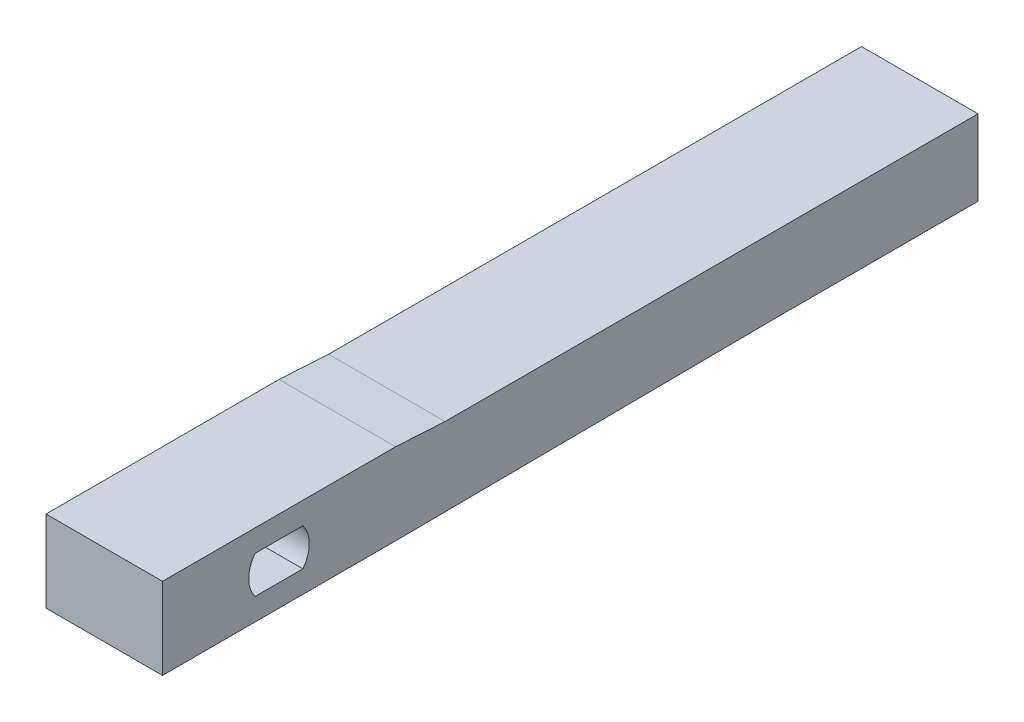
ISO-10303-21;
HEADER;
FILE_DESCRIPTION(('STEP AP214'),'2;1');
FILE_NAME('part.step','',(''),(''),'','','');
FILE_SCHEMA(('AUTOMOTIVE_DESIGN { 1 0 10303 214 1 1 1 1 }'));
ENDSEC;
DATA;
#1=APPLICATION_CONTEXT('core data for automotive mechanical design processes');
#2=APPLICATION_PROTOCOL_DEFINITION('international standard','automotive_design',2000,#1);
#3=PRODUCT_CONTEXT('',#1,'mechanical');
#4=PRODUCT('Part','Part','',(#3));
#5=PRODUCT_RELATED_PRODUCT_CATEGORY('part','',(#4));
#6=PRODUCT_DEFINITION_FORMATION('','',#4);
#7=PRODUCT_DEFINITION_CONTEXT('part definition',#1,'design');
#8=PRODUCT_DEFINITION('design','',#6,#7);
#9=PRODUCT_DEFINITION_SHAPE('','',#8);
#10=(LENGTH_UNIT() NAMED_UNIT(*) SI_UNIT(.MILLI.,.METRE.));
#11=(NAMED_UNIT(*) PLANE_ANGLE_UNIT() SI_UNIT($,.RADIAN.));
#12=(NAMED_UNIT(*) SI_UNIT($,.STERADIAN.) SOLID_ANGLE_UNIT());
#13=UNCERTAINTY_MEASURE_WITH_UNIT(LENGTH_MEASURE(1.E-05),#10,'distance_accuracy_value','');
#14=(GEOMETRIC_REPRESENTATION_CONTEXT(3) GLOBAL_UNCERTAINTY_ASSIGNED_CONTEXT((#13)) GLOBAL_UNIT_ASSIGNED_CONTEXT((#10,
#11,#12)) REPRESENTATION_CONTEXT('',''));
#15=CARTESIAN_POINT('',(0.,0.,0.));
#16=DIRECTION('',(0.,0.,1.));
#17=DIRECTION('',(1.,0.,0.));
#18=AXIS2_PLACEMENT_3D('',#15,#16,#17);
#19=CARTESIAN_POINT('',(-14.,0.,0.));
#20=DIRECTION('',(1.,0.,0.));
#21=DIRECTION('',(0.,0.,-1.));
#22=AXIS2_PLACEMENT_3D('',#19,#20,#21);
#23=PLANE('',#22);
#24=DIRECTION('',(0.,-0.0585719765468977,-0.998283188060076));
#25=VECTOR('',#24,1.);
#26=CARTESIAN_POINT('',(-14.,11.25,-14.2609249632406));
#27=LINE('',#26,#25);
#28=CARTESIAN_POINT('',(-14.,11.5,-10.));
#29=VERTEX_POINT('',#28);
#30=CARTESIAN_POINT('',(-14.,11.25,-14.2609249632406));
#31=VERTEX_POINT('',#30);
#32=EDGE_CURVE('E164',#29,#31,#27,.T.);
#33=ORIENTED_EDGE('',*,*,#32,.T.);
#34=DIRECTION('',(0.,0.,-1.));
#35=VECTOR('',#34,1.);
#36=CARTESIAN_POINT('',(-14.,11.25,-60.));
#37=LINE('',#36,#35);
#38=CARTESIAN_POINT('',(-14.,11.25,-60.));
#39=VERTEX_POINT('',#38);
#40=EDGE_CURVE('E167',#31,#39,#37,.T.);
#41=ORIENTED_EDGE('',*,*,#40,.T.);
#42=DIRECTION('',(0.,-1.,0.));
#43=VECTOR('',#42,1.);
#44=CARTESIAN_POINT('',(-14.,11.25,-60.));
#45=LINE('',#44,#43);
#46=CARTESIAN_POINT('',(-14.,4.74999999999999,-60.));
#47=VERTEX_POINT('',#46);
#48=EDGE_CURVE('E170',#39,#47,#45,.T.);
#49=ORIENTED_EDGE('',*,*,#48,.T.);
#50=DIRECTION('',(0.,0.,1.));
#51=VECTOR('',#50,1.);
#52=CARTESIAN_POINT('',(-14.,4.74999999999999,-60.));
#53=LINE('',#52,#51);
#54=CARTESIAN_POINT('',(-14.,4.74999999999999,-42.6358669668135));
#55=VERTEX_POINT('',#54);
#56=EDGE_CURVE('E172',#47,#55,#53,.T.);
#57=ORIENTED_EDGE('',*,*,#56,.T.);
#58=DIRECTION('',(0.,-0.00766005896468735,0.99997066131795));
#59=VECTOR('',#58,1.);
#60=CARTESIAN_POINT('',(-14.,4.74999999999999,-42.6358669668135));
#61=LINE('',#60,#59);
#62=CARTESIAN_POINT('',(-14.,4.5,-10.));
#63=VERTEX_POINT('',#62);
#64=EDGE_CURVE('E174',#55,#63,#61,.T.);
#65=ORIENTED_EDGE('',*,*,#64,.T.);
#66=DIRECTION('',(0.,0.,1.));
#67=VECTOR('',#66,1.);
#68=CARTESIAN_POINT('',(-14.,4.5,-10.));
#69=LINE('',#68,#67);
#70=CARTESIAN_POINT('',(-14.,4.5,9.99999999999999));
#71=VERTEX_POINT('',#70);
#72=EDGE_CURVE('E176',#63,#71,#69,.T.);
#73=ORIENTED_EDGE('',*,*,#72,.T.);
#74=DIRECTION('',(0.,1.,0.));
#75=VECTOR('',#74,1.);
#76=CARTESIAN_POINT('',(-14.,11.5,9.99999999999999));
#77=LINE('',#76,#75);
#78=CARTESIAN_POINT('',(-14.,11.5,9.99999999999999));
#79=VERTEX_POINT('',#78);
#80=EDGE_CURVE('E178',#71,#79,#77,.T.);
#81=ORIENTED_EDGE('',*,*,#80,.T.);
#82=DIRECTION('',(0.,0.,-1.));
#83=VECTOR('',#82,1.);
#84=CARTESIAN_POINT('',(-14.,11.5,-10.));
#85=LINE('',#84,#83);
#86=EDGE_CURVE('E180',#79,#29,#85,.T.);
#87=ORIENTED_EDGE('',*,*,#86,.T.);
#88=EDGE_LOOP('',(#33,#41,#49,#57,#65,#73,#81,#87));
#89=FACE_BOUND('',#88,.T.);
#90=CARTESIAN_POINT('',(-14.,8.,0.));
#91=DIRECTION('',(-1.,0.,0.));
#92=DIRECTION('',(0.,0.,1.));
#93=AXIS2_PLACEMENT_3D('',#90,#91,#92);
#94=CIRCLE('',#93,2.6);
#95=CARTESIAN_POINT('',(-14.,9.6,-2.04939015319192));
#96=VERTEX_POINT('',#95);
#97=CARTESIAN_POINT('',(-14.,6.4,-2.04939015319192));
#98=VERTEX_POINT('',#97);
#99=EDGE_CURVE('E128',#96,#98,#94,.T.);
#100=ORIENTED_EDGE('',*,*,#99,.F.);
#101=DIRECTION('',(0.,0.,-1.));
#102=VECTOR('',#101,1.);
#103=CARTESIAN_POINT('',(-14.,9.6,-2.04939015319192));
#104=LINE('',#103,#102);
#105=CARTESIAN_POINT('',(-14.,9.6,2.04939015319192));
#106=VERTEX_POINT('',#105);
#107=EDGE_CURVE('E150',#106,#96,#104,.T.);
#108=ORIENTED_EDGE('',*,*,#107,.F.);
#109=CARTESIAN_POINT('',(-14.,8.,0.));
#110=DIRECTION('',(-1.,0.,0.));
#111=DIRECTION('',(0.,0.,1.));
#112=AXIS2_PLACEMENT_3D('',#109,#110,#111);
#113=CIRCLE('',#112,2.6);
#114=CARTESIAN_POINT('',(-14.,6.4,2.04939015319192));
#115=VERTEX_POINT('',#114);
#116=EDGE_CURVE('E148',#115,#106,#113,.T.);
#117=ORIENTED_EDGE('',*,*,#116,.F.);
#118=DIRECTION('',(0.,0.,1.));
#119=VECTOR('',#118,1.);
#120=CARTESIAN_POINT('',(-14.,6.4,2.04939015319192));
#121=LINE('',#120,#119);
#122=EDGE_CURVE('E136',#98,#115,#121,.T.);
#123=ORIENTED_EDGE('',*,*,#122,.F.);
#124=EDGE_LOOP('',(#100,#108,#117,#123));
#125=FACE_BOUND('',#124,.T.);
#126=ADVANCED_FACE('F39',(#89,#125),#23,.F.);
#127=CARTESIAN_POINT('',(-4.,0.,0.));
#128=DIRECTION('',(1.,0.,0.));
#129=DIRECTION('',(0.,0.,-1.));
#130=AXIS2_PLACEMENT_3D('',#127,#128,#129);
#131=PLANE('',#130);
#132=DIRECTION('',(0.,-0.0585719765468977,-0.998283188060076));
#133=VECTOR('',#132,1.);
#134=CARTESIAN_POINT('',(-4.,11.25,-14.2609249632406));
#135=LINE('',#134,#133);
#136=CARTESIAN_POINT('',(-4.,11.5,-10.));
#137=VERTEX_POINT('',#136);
#138=CARTESIAN_POINT('',(-4.,11.25,-14.2609249632406));
#139=VERTEX_POINT('',#138);
#140=EDGE_CURVE('E144',#137,#139,#135,.T.);
#141=ORIENTED_EDGE('',*,*,#140,.F.);
#142=DIRECTION('',(0.,0.,-1.));
#143=VECTOR('',#142,1.);
#144=CARTESIAN_POINT('',(-4.,11.5,-10.));
#145=LINE('',#144,#143);
#146=CARTESIAN_POINT('',(-4.,11.5,9.99999999999999));
#147=VERTEX_POINT('',#146);
#148=EDGE_CURVE('E168',#147,#137,#145,.T.);
#149=ORIENTED_EDGE('',*,*,#148,.F.);
#150=DIRECTION('',(0.,1.,0.));
#151=VECTOR('',#150,1.);
#152=CARTESIAN_POINT('',(-4.,11.5,9.99999999999999));
#153=LINE('',#152,#151);
#154=CARTESIAN_POINT('',(-4.,4.5,9.99999999999999));
#155=VERTEX_POINT('',#154);
#156=EDGE_CURVE('E195',#155,#147,#153,.T.);
#157=ORIENTED_EDGE('',*,*,#156,.F.);
#158=DIRECTION('',(0.,0.,1.));
#159=VECTOR('',#158,1.);
#160=CARTESIAN_POINT('',(-4.,4.5,-10.));
#161=LINE('',#160,#159);
#162=CARTESIAN_POINT('',(-4.,4.5,-10.));
#163=VERTEX_POINT('',#162);
#164=EDGE_CURVE('E193',#163,#155,#161,.T.);
#165=ORIENTED_EDGE('',*,*,#164,.F.);
#166=DIRECTION('',(0.,-0.00766005896468735,0.99997066131795));
#167=VECTOR('',#166,1.);
#168=CARTESIAN_POINT('',(-4.,4.74999999999999,-42.6358669668135));
#169=LINE('',#168,#167);
#170=CARTESIAN_POINT('',(-4.,4.74999999999999,-42.6358669668135));
#171=VERTEX_POINT('',#170);
#172=EDGE_CURVE('E191',#171,#163,#169,.T.);
#173=ORIENTED_EDGE('',*,*,#172,.F.);
#174=DIRECTION('',(0.,0.,1.));
#175=VECTOR('',#174,1.);
#176=CARTESIAN_POINT('',(-4.,4.74999999999999,-60.));
#177=LINE('',#176,#175);
#178=CARTESIAN_POINT('',(-4.,4.74999999999999,-60.));
#179=VERTEX_POINT('',#178);
#180=EDGE_CURVE('E189',#179,#171,#177,.T.);
#181=ORIENTED_EDGE('',*,*,#180,.F.);
#182=DIRECTION('',(0.,-1.,0.));
#183=VECTOR('',#182,1.);
#184=CARTESIAN_POINT('',(-4.,11.25,-60.));
#185=LINE('',#184,#183);
#186=CARTESIAN_POINT('',(-4.,11.25,-60.));
#187=VERTEX_POINT('',#186);
#188=EDGE_CURVE('E187',#187,#179,#185,.T.);
#189=ORIENTED_EDGE('',*,*,#188,.F.);
#190=DIRECTION('',(0.,0.,-1.));
#191=VECTOR('',#190,1.);
#192=CARTESIAN_POINT('',(-4.,11.25,-60.));
#193=LINE('',#192,#191);
#194=EDGE_CURVE('E185',#139,#187,#193,.T.);
#195=ORIENTED_EDGE('',*,*,#194,.F.);
#196=EDGE_LOOP('',(#141,#149,#157,#165,#173,#181,#189,#195));
#197=FACE_BOUND('',#196,.T.);
#198=DIRECTION('',(0.,0.,-1.));
#199=VECTOR('',#198,1.);
#200=CARTESIAN_POINT('',(-4.,9.6,-2.04939015319192));
#201=LINE('',#200,#199);
#202=CARTESIAN_POINT('',(-4.,9.6,2.04939015319192));
#203=VERTEX_POINT('',#202);
#204=CARTESIAN_POINT('',(-4.,9.6,-2.04939015319192));
#205=VERTEX_POINT('',#204);
#206=EDGE_CURVE('E137',#203,#205,#201,.T.);
#207=ORIENTED_EDGE('',*,*,#206,.T.);
#208=CARTESIAN_POINT('',(-4.,8.,0.));
#209=DIRECTION('',(-1.,0.,0.));
#210=DIRECTION('',(0.,0.,1.));
#211=AXIS2_PLACEMENT_3D('',#208,#209,#210);
#212=CIRCLE('',#211,2.6);
#213=CARTESIAN_POINT('',(-4.,6.4,-2.04939015319192));
#214=VERTEX_POINT('',#213);
#215=EDGE_CURVE('E62',#205,#214,#212,.T.);
#216=ORIENTED_EDGE('',*,*,#215,.T.);
#217=DIRECTION('',(0.,0.,1.));
#218=VECTOR('',#217,1.);
#219=CARTESIAN_POINT('',(-4.,6.4,2.04939015319192));
#220=LINE('',#219,#218);
#221=CARTESIAN_POINT('',(-4.,6.4,2.04939015319192));
#222=VERTEX_POINT('',#221);
#223=EDGE_CURVE('E143',#214,#222,#220,.T.);
#224=ORIENTED_EDGE('',*,*,#223,.T.);
#225=CARTESIAN_POINT('',(-4.,8.,0.));
#226=DIRECTION('',(-1.,0.,0.));
#227=DIRECTION('',(0.,0.,1.));
#228=AXIS2_PLACEMENT_3D('',#225,#226,#227);
#229=CIRCLE('',#228,2.6);
#230=EDGE_CURVE('E156',#222,#203,#229,.T.);
#231=ORIENTED_EDGE('',*,*,#230,.T.);
#232=EDGE_LOOP('',(#207,#216,#224,#231));
#233=FACE_BOUND('',#232,.T.);
#234=ADVANCED_FACE('F225',(#197,#233),#131,.T.);
#235=CARTESIAN_POINT('',(-14.,11.25,-14.2609249632406));
#236=DIRECTION('',(0.,-0.998283188060076,0.0585719765468977));
#237=DIRECTION('',(0.,-0.0585719765468977,-0.998283188060076));
#238=AXIS2_PLACEMENT_3D('',#235,#236,#237);
#239=PLANE('',#238);
#240=ORIENTED_EDGE('',*,*,#140,.T.);
#241=DIRECTION('',(1.,0.,0.));
#242=VECTOR('',#241,1.);
#243=CARTESIAN_POINT('',(-14.,11.25,-14.2609249632406));
#244=LINE('',#243,#242);
#245=EDGE_CURVE('E11',#31,#139,#244,.T.);
#246=ORIENTED_EDGE('',*,*,#245,.F.);
#247=ORIENTED_EDGE('',*,*,#32,.F.);
#248=DIRECTION('',(1.,0.,0.));
#249=VECTOR('',#248,1.);
#250=CARTESIAN_POINT('',(-14.,11.5,-10.));
#251=LINE('',#250,#249);
#252=EDGE_CURVE('E182',#29,#137,#251,.T.);
#253=ORIENTED_EDGE('',*,*,#252,.T.);
#254=EDGE_LOOP('',(#240,#246,#247,#253));
#255=FACE_BOUND('',#254,.T.);
#256=ADVANCED_FACE('F41',(#255),#239,.F.);
#257=CARTESIAN_POINT('',(-14.,11.25,-60.));
#258=DIRECTION('',(0.,-1.,0.));
#259=DIRECTION('',(0.,0.,-1.));
#260=AXIS2_PLACEMENT_3D('',#257,#258,#259);
#261=PLANE('',#260);
#262=ORIENTED_EDGE('',*,*,#194,.T.);
#263=DIRECTION('',(1.,0.,0.));
#264=VECTOR('',#263,1.);
#265=CARTESIAN_POINT('',(-14.,11.25,-60.));
#266=LINE('',#265,#264);
#267=EDGE_CURVE('E47',#39,#187,#266,.T.);
#268=ORIENTED_EDGE('',*,*,#267,.F.);
#269=ORIENTED_EDGE('',*,*,#40,.F.);
#270=ORIENTED_EDGE('',*,*,#245,.T.);
#271=EDGE_LOOP('',(#262,#268,#269,#270));
#272=FACE_BOUND('',#271,.T.);
#273=ADVANCED_FACE('F242',(#272),#261,.F.);
#274=CARTESIAN_POINT('',(-14.,11.25,-60.));
#275=DIRECTION('',(0.,0.,1.));
#276=DIRECTION('',(1.,0.,0.));
#277=AXIS2_PLACEMENT_3D('',#274,#275,#276);
#278=PLANE('',#277);
#279=ORIENTED_EDGE('',*,*,#188,.T.);
#280=DIRECTION('',(1.,0.,0.));
#281=VECTOR('',#280,1.);
#282=CARTESIAN_POINT('',(-14.,4.74999999999999,-60.));
#283=LINE('',#282,#281);
#284=EDGE_CURVE('E212',#47,#179,#283,.T.);
#285=ORIENTED_EDGE('',*,*,#284,.F.);
#286=ORIENTED_EDGE('',*,*,#48,.F.);
#287=ORIENTED_EDGE('',*,*,#267,.T.);
#288=EDGE_LOOP('',(#279,#285,#286,#287));
#289=FACE_BOUND('',#288,.T.);
#290=ADVANCED_FACE('F219',(#289),#278,.F.);
#291=CARTESIAN_POINT('',(-14.,4.74999999999999,-60.));
#292=DIRECTION('',(0.,1.,0.));
#293=DIRECTION('',(0.,0.,1.));
#294=AXIS2_PLACEMENT_3D('',#291,#292,#293);
#295=PLANE('',#294);
#296=ORIENTED_EDGE('',*,*,#180,.T.);
#297=DIRECTION('',(1.,0.,0.));
#298=VECTOR('',#297,1.);
#299=CARTESIAN_POINT('',(-14.,4.74999999999999,-42.6358669668135));
#300=LINE('',#299,#298);
#301=EDGE_CURVE('E209',#55,#171,#300,.T.);
#302=ORIENTED_EDGE('',*,*,#301,.F.);
#303=ORIENTED_EDGE('',*,*,#56,.F.);
#304=ORIENTED_EDGE('',*,*,#284,.T.);
#305=EDGE_LOOP('',(#296,#302,#303,#304));
#306=FACE_BOUND('',#305,.T.);
#307=ADVANCED_FACE('F231',(#306),#295,.F.);
#308=CARTESIAN_POINT('',(-14.,4.74999999999999,-42.6358669668135));
#309=DIRECTION('',(0.,0.99997066131795,0.00766005896468735));
#310=DIRECTION('',(0.,-0.00766005896468735,0.99997066131795));
#311=AXIS2_PLACEMENT_3D('',#308,#309,#310);
#312=PLANE('',#311);
#313=ORIENTED_EDGE('',*,*,#172,.T.);
#314=DIRECTION('',(1.,0.,0.));
#315=VECTOR('',#314,1.);
#316=CARTESIAN_POINT('',(-14.,4.5,-10.));
#317=LINE('',#316,#315);
#318=EDGE_CURVE('E206',#63,#163,#317,.T.);
#319=ORIENTED_EDGE('',*,*,#318,.F.);
#320=ORIENTED_EDGE('',*,*,#64,.F.);
#321=ORIENTED_EDGE('',*,*,#301,.T.);
#322=EDGE_LOOP('',(#313,#319,#320,#321));
#323=FACE_BOUND('',#322,.T.);
#324=ADVANCED_FACE('F235',(#323),#312,.F.);
#325=CARTESIAN_POINT('',(-14.,4.5,-10.));
#326=DIRECTION('',(0.,1.,0.));
#327=DIRECTION('',(0.,0.,1.));
#328=AXIS2_PLACEMENT_3D('',#325,#326,#327);
#329=PLANE('',#328);
#330=ORIENTED_EDGE('',*,*,#164,.T.);
#331=DIRECTION('',(1.,0.,0.));
#332=VECTOR('',#331,1.);
#333=CARTESIAN_POINT('',(-14.,4.5,9.99999999999999));
#334=LINE('',#333,#332);
#335=EDGE_CURVE('E203',#71,#155,#334,.T.);
#336=ORIENTED_EDGE('',*,*,#335,.F.);
#337=ORIENTED_EDGE('',*,*,#72,.F.);
#338=ORIENTED_EDGE('',*,*,#318,.T.);
#339=EDGE_LOOP('',(#330,#336,#337,#338));
#340=FACE_BOUND('',#339,.T.);
#341=ADVANCED_FACE('F255',(#340),#329,.F.);
#342=CARTESIAN_POINT('',(-14.,11.5,9.99999999999999));
#343=DIRECTION('',(0.,0.,-1.));
#344=DIRECTION('',(-1.,0.,0.));
#345=AXIS2_PLACEMENT_3D('',#342,#343,#344);
#346=PLANE('',#345);
#347=ORIENTED_EDGE('',*,*,#156,.T.);
#348=DIRECTION('',(1.,0.,0.));
#349=VECTOR('',#348,1.);
#350=CARTESIAN_POINT('',(-14.,11.5,9.99999999999999));
#351=LINE('',#350,#349);
#352=EDGE_CURVE('E200',#79,#147,#351,.T.);
#353=ORIENTED_EDGE('',*,*,#352,.F.);
#354=ORIENTED_EDGE('',*,*,#80,.F.);
#355=ORIENTED_EDGE('',*,*,#335,.T.);
#356=EDGE_LOOP('',(#347,#353,#354,#355));
#357=FACE_BOUND('',#356,.T.);
#358=ADVANCED_FACE('F253',(#357),#346,.F.);
#359=CARTESIAN_POINT('',(-14.,11.5,-10.));
#360=DIRECTION('',(0.,-1.,0.));
#361=DIRECTION('',(0.,0.,-1.));
#362=AXIS2_PLACEMENT_3D('',#359,#360,#361);
#363=PLANE('',#362);
#364=ORIENTED_EDGE('',*,*,#148,.T.);
#365=ORIENTED_EDGE('',*,*,#252,.F.);
#366=ORIENTED_EDGE('',*,*,#86,.F.);
#367=ORIENTED_EDGE('',*,*,#352,.T.);
#368=EDGE_LOOP('',(#364,#365,#366,#367));
#369=FACE_BOUND('',#368,.T.);
#370=ADVANCED_FACE('F248',(#369),#363,.F.);
#371=CARTESIAN_POINT('',(-14.,8.,0.));
#372=DIRECTION('',(1.,0.,0.));
#373=DIRECTION('',(0.,0.,-1.));
#374=AXIS2_PLACEMENT_3D('',#371,#372,#373);
#375=CYLINDRICAL_SURFACE('',#374,2.6);
#376=ORIENTED_EDGE('',*,*,#215,.F.);
#377=DIRECTION('',(1.,0.,0.));
#378=VECTOR('',#377,1.);
#379=CARTESIAN_POINT('',(-14.,9.6,-2.04939015319192));
#380=LINE('',#379,#378);
#381=EDGE_CURVE('E132',#96,#205,#380,.T.);
#382=ORIENTED_EDGE('',*,*,#381,.F.);
#383=ORIENTED_EDGE('',*,*,#99,.T.);
#384=DIRECTION('',(1.,0.,0.));
#385=VECTOR('',#384,1.);
#386=CARTESIAN_POINT('',(-14.,6.4,-2.04939015319192));
#387=LINE('',#386,#385);
#388=EDGE_CURVE('E131',#98,#214,#387,.T.);
#389=ORIENTED_EDGE('',*,*,#388,.T.);
#390=EDGE_LOOP('',(#376,#382,#383,#389));
#391=FACE_BOUND('',#390,.T.);
#392=ADVANCED_FACE('F130',(#391),#375,.F.);
#393=CARTESIAN_POINT('',(-14.,6.4,2.04939015319192));
#394=DIRECTION('',(0.,1.,0.));
#395=DIRECTION('',(0.,0.,1.));
#396=AXIS2_PLACEMENT_3D('',#393,#394,#395);
#397=PLANE('',#396);
#398=ORIENTED_EDGE('',*,*,#223,.F.);
#399=ORIENTED_EDGE('',*,*,#388,.F.);
#400=ORIENTED_EDGE('',*,*,#122,.T.);
#401=DIRECTION('',(1.,0.,0.));
#402=VECTOR('',#401,1.);
#403=CARTESIAN_POINT('',(-14.,6.4,2.04939015319192));
#404=LINE('',#403,#402);
#405=EDGE_CURVE('E145',#115,#222,#404,.T.);
#406=ORIENTED_EDGE('',*,*,#405,.T.);
#407=EDGE_LOOP('',(#398,#399,#400,#406));
#408=FACE_BOUND('',#407,.T.);
#409=ADVANCED_FACE('F140',(#408),#397,.T.);
#410=CARTESIAN_POINT('',(-14.,8.,0.));
#411=DIRECTION('',(1.,0.,0.));
#412=DIRECTION('',(0.,0.,-1.));
#413=AXIS2_PLACEMENT_3D('',#410,#411,#412);
#414=CYLINDRICAL_SURFACE('',#413,2.6);
#415=ORIENTED_EDGE('',*,*,#230,.F.);
#416=ORIENTED_EDGE('',*,*,#405,.F.);
#417=ORIENTED_EDGE('',*,*,#116,.T.);
#418=DIRECTION('',(1.,0.,0.));
#419=VECTOR('',#418,1.);
#420=CARTESIAN_POINT('',(-14.,9.6,2.04939015319192));
#421=LINE('',#420,#419);
#422=EDGE_CURVE('E54',#106,#203,#421,.T.);
#423=ORIENTED_EDGE('',*,*,#422,.T.);
#424=EDGE_LOOP('',(#415,#416,#417,#423));
#425=FACE_BOUND('',#424,.T.);
#426=ADVANCED_FACE('F280',(#425),#414,.F.);
#427=CARTESIAN_POINT('',(-14.,9.6,-2.04939015319192));
#428=DIRECTION('',(0.,-1.,0.));
#429=DIRECTION('',(0.,0.,-1.));
#430=AXIS2_PLACEMENT_3D('',#427,#428,#429);
#431=PLANE('',#430);
#432=ORIENTED_EDGE('',*,*,#206,.F.);
#433=ORIENTED_EDGE('',*,*,#422,.F.);
#434=ORIENTED_EDGE('',*,*,#107,.T.);
#435=ORIENTED_EDGE('',*,*,#381,.T.);
#436=EDGE_LOOP('',(#432,#433,#434,#435));
#437=FACE_BOUND('',#436,.T.);
#438=ADVANCED_FACE('F284',(#437),#431,.T.);
#439=CLOSED_SHELL('',(#126,#234,#256,#273,#290,#307,#324,#341,#358,#370,#392,#409,#426,#438));
#440=MANIFOLD_SOLID_BREP('B2',#439);
#441=ADVANCED_BREP_SHAPE_REPRESENTATION('',(#18,#440),#14);
#442=SHAPE_DEFINITION_REPRESENTATION(#9,#441);
ENDSEC;
END-ISO-10303-21;
